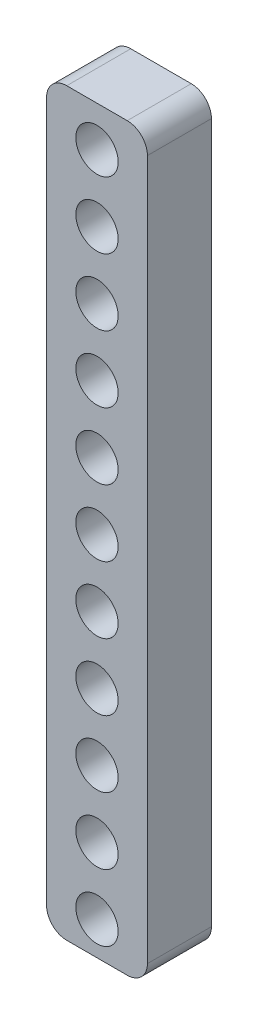
ISO-10303-21;
HEADER;
FILE_DESCRIPTION(('STEP AP214'),'2;1');
FILE_NAME('part.step','',(''),(''),'','','');
FILE_SCHEMA(('AUTOMOTIVE_DESIGN { 1 0 10303 214 1 1 1 1 }'));
ENDSEC;
DATA;
#1=APPLICATION_CONTEXT('core data for automotive mechanical design processes');
#2=APPLICATION_PROTOCOL_DEFINITION('international standard','automotive_design',2000,#1);
#3=PRODUCT_CONTEXT('',#1,'mechanical');
#4=PRODUCT('Part','Part','',(#3));
#5=PRODUCT_RELATED_PRODUCT_CATEGORY('part','',(#4));
#6=PRODUCT_DEFINITION_FORMATION('','',#4);
#7=PRODUCT_DEFINITION_CONTEXT('part definition',#1,'design');
#8=PRODUCT_DEFINITION('design','',#6,#7);
#9=PRODUCT_DEFINITION_SHAPE('','',#8);
#10=(LENGTH_UNIT() NAMED_UNIT(*) SI_UNIT(.MILLI.,.METRE.));
#11=(NAMED_UNIT(*) PLANE_ANGLE_UNIT() SI_UNIT($,.RADIAN.));
#12=(NAMED_UNIT(*) SI_UNIT($,.STERADIAN.) SOLID_ANGLE_UNIT());
#13=UNCERTAINTY_MEASURE_WITH_UNIT(LENGTH_MEASURE(1.E-05),#10,'distance_accuracy_value','');
#14=(GEOMETRIC_REPRESENTATION_CONTEXT(3) GLOBAL_UNCERTAINTY_ASSIGNED_CONTEXT((#13)) GLOBAL_UNIT_ASSIGNED_CONTEXT((#10,
#11,#12)) REPRESENTATION_CONTEXT('',''));
#15=CARTESIAN_POINT('',(0.,0.,0.));
#16=DIRECTION('',(0.,0.,1.));
#17=DIRECTION('',(1.,0.,0.));
#18=AXIS2_PLACEMENT_3D('',#15,#16,#17);
#19=CARTESIAN_POINT('',(-2.99999999999997,-78.,6.35));
#20=DIRECTION('',(0.,0.,-1.));
#21=DIRECTION('',(-1.,0.,0.));
#22=AXIS2_PLACEMENT_3D('',#19,#20,#21);
#23=PLANE('',#22);
#24=DIRECTION('',(1.,0.,0.));
#25=VECTOR('',#24,1.);
#26=CARTESIAN_POINT('',(-8.85626377502826,6.60869565217392,6.35));
#27=LINE('',#26,#25);
#28=CARTESIAN_POINT('',(-3.,6.60869565217392,6.35));
#29=VERTEX_POINT('',#28);
#30=CARTESIAN_POINT('',(2.99999999999997,6.60869565217392,6.35));
#31=VERTEX_POINT('',#30);
#32=EDGE_CURVE('E165',#29,#31,#27,.T.);
#33=ORIENTED_EDGE('',*,*,#32,.T.);
#34=CARTESIAN_POINT('',(2.99999999999997,8.60869565217391,6.35));
#35=DIRECTION('',(0.,0.,-1.));
#36=DIRECTION('',(-1.,0.,0.));
#37=AXIS2_PLACEMENT_3D('',#34,#35,#36);
#38=CIRCLE('',#37,2.);
#39=CARTESIAN_POINT('',(4.99999999999997,8.60869565217391,6.35));
#40=VERTEX_POINT('',#39);
#41=EDGE_CURVE('E47',#31,#40,#38,.F.);
#42=ORIENTED_EDGE('',*,*,#41,.T.);
#43=DIRECTION('',(0.,1.,0.));
#44=VECTOR('',#43,1.);
#45=CARTESIAN_POINT('',(4.99999999999997,-78.,6.35));
#46=LINE('',#45,#44);
#47=CARTESIAN_POINT('',(4.99999999999997,78.,6.35));
#48=VERTEX_POINT('',#47);
#49=EDGE_CURVE('E105',#40,#48,#46,.T.);
#50=ORIENTED_EDGE('',*,*,#49,.T.);
#51=CARTESIAN_POINT('',(2.99999999999997,78.,6.35));
#52=DIRECTION('',(0.,0.,1.));
#53=DIRECTION('',(1.,0.,0.));
#54=AXIS2_PLACEMENT_3D('',#51,#52,#53);
#55=CIRCLE('',#54,2.);
#56=CARTESIAN_POINT('',(2.99999999999996,80.,6.35));
#57=VERTEX_POINT('',#56);
#58=EDGE_CURVE('E109',#48,#57,#55,.T.);
#59=ORIENTED_EDGE('',*,*,#58,.T.);
#60=DIRECTION('',(-1.,0.,0.));
#61=VECTOR('',#60,1.);
#62=CARTESIAN_POINT('',(2.99999999999995,80.,6.35));
#63=LINE('',#62,#61);
#64=CARTESIAN_POINT('',(-3.00000000000002,80.,6.35));
#65=VERTEX_POINT('',#64);
#66=EDGE_CURVE('E130',#57,#65,#63,.T.);
#67=ORIENTED_EDGE('',*,*,#66,.T.);
#68=CARTESIAN_POINT('',(-3.00000000000003,78.,6.35));
#69=DIRECTION('',(0.,0.,1.));
#70=DIRECTION('',(1.,0.,0.));
#71=AXIS2_PLACEMENT_3D('',#68,#69,#70);
#72=CIRCLE('',#71,2.);
#73=CARTESIAN_POINT('',(-5.00000000000003,78.,6.35));
#74=VERTEX_POINT('',#73);
#75=EDGE_CURVE('E132',#65,#74,#72,.T.);
#76=ORIENTED_EDGE('',*,*,#75,.T.);
#77=DIRECTION('',(0.,-1.,0.));
#78=VECTOR('',#77,1.);
#79=CARTESIAN_POINT('',(-4.99999999999997,-78.,6.35));
#80=LINE('',#79,#78);
#81=CARTESIAN_POINT('',(-5.,8.60869565217391,6.35));
#82=VERTEX_POINT('',#81);
#83=EDGE_CURVE('E137',#74,#82,#80,.T.);
#84=ORIENTED_EDGE('',*,*,#83,.T.);
#85=CARTESIAN_POINT('',(-3.,8.60869565217391,6.35));
#86=DIRECTION('',(0.,0.,-1.));
#87=DIRECTION('',(-1.,0.,0.));
#88=AXIS2_PLACEMENT_3D('',#85,#86,#87);
#89=CIRCLE('',#88,2.);
#90=EDGE_CURVE('E54',#82,#29,#89,.F.);
#91=ORIENTED_EDGE('',*,*,#90,.T.);
#92=EDGE_LOOP('',(#33,#42,#50,#59,#67,#76,#84,#91));
#93=FACE_BOUND('',#92,.T.);
#94=CARTESIAN_POINT('',(0.,76.,6.35));
#95=DIRECTION('',(0.,0.,1.));
#96=DIRECTION('',(1.,0.,0.));
#97=AXIS2_PLACEMENT_3D('',#94,#95,#96);
#98=CIRCLE('',#97,2.09999999999985);
#99=CARTESIAN_POINT('',(2.09999999999985,76.,6.35));
#100=VERTEX_POINT('',#99);
#101=EDGE_CURVE('E143',#100,#100,#98,.T.);
#102=ORIENTED_EDGE('',*,*,#101,.F.);
#103=EDGE_LOOP('',(#102));
#104=FACE_BOUND('',#103,.T.);
#105=CARTESIAN_POINT('',(0.,69.3913043478261,6.35));
#106=DIRECTION('',(0.,0.,1.));
#107=DIRECTION('',(1.,0.,0.));
#108=AXIS2_PLACEMENT_3D('',#105,#106,#107);
#109=CIRCLE('',#108,2.10000000000001);
#110=CARTESIAN_POINT('',(2.10000000000008,69.3913043478261,6.35));
#111=VERTEX_POINT('',#110);
#112=EDGE_CURVE('E224',#111,#111,#109,.T.);
#113=ORIENTED_EDGE('',*,*,#112,.F.);
#114=EDGE_LOOP('',(#113));
#115=FACE_BOUND('',#114,.T.);
#116=CARTESIAN_POINT('',(1.37635493464256E-13,62.7826086956522,6.35));
#117=DIRECTION('',(0.,0.,1.));
#118=DIRECTION('',(1.,0.,0.));
#119=AXIS2_PLACEMENT_3D('',#116,#117,#118);
#120=CIRCLE('',#119,2.10000000000001);
#121=CARTESIAN_POINT('',(2.10000000000014,62.7826086956522,6.35));
#122=VERTEX_POINT('',#121);
#123=EDGE_CURVE('E231',#122,#122,#120,.T.);
#124=ORIENTED_EDGE('',*,*,#123,.F.);
#125=EDGE_LOOP('',(#124));
#126=FACE_BOUND('',#125,.T.);
#127=CARTESIAN_POINT('',(2.06453240196385E-13,56.1739130434783,6.35));
#128=DIRECTION('',(0.,0.,1.));
#129=DIRECTION('',(1.,0.,0.));
#130=AXIS2_PLACEMENT_3D('',#127,#128,#129);
#131=CIRCLE('',#130,2.10000000000001);
#132=CARTESIAN_POINT('',(2.10000000000021,56.1739130434783,6.35));
#133=VERTEX_POINT('',#132);
#134=EDGE_CURVE('E236',#133,#133,#131,.T.);
#135=ORIENTED_EDGE('',*,*,#134,.F.);
#136=EDGE_LOOP('',(#135));
#137=FACE_BOUND('',#136,.T.);
#138=CARTESIAN_POINT('',(2.75270986928513E-13,49.5652173913043,6.35));
#139=DIRECTION('',(0.,0.,1.));
#140=DIRECTION('',(1.,0.,0.));
#141=AXIS2_PLACEMENT_3D('',#138,#139,#140);
#142=CIRCLE('',#141,2.10000000000001);
#143=CARTESIAN_POINT('',(2.10000000000028,49.5652173913043,6.35));
#144=VERTEX_POINT('',#143);
#145=EDGE_CURVE('E242',#144,#144,#142,.T.);
#146=ORIENTED_EDGE('',*,*,#145,.F.);
#147=EDGE_LOOP('',(#146));
#148=FACE_BOUND('',#147,.T.);
#149=CARTESIAN_POINT('',(3.44088733660641E-13,42.9565217391304,6.35));
#150=DIRECTION('',(0.,0.,1.));
#151=DIRECTION('',(1.,0.,0.));
#152=AXIS2_PLACEMENT_3D('',#149,#150,#151);
#153=CIRCLE('',#152,2.10000000000001);
#154=CARTESIAN_POINT('',(2.10000000000035,42.9565217391304,6.35));
#155=VERTEX_POINT('',#154);
#156=EDGE_CURVE('E248',#155,#155,#153,.T.);
#157=ORIENTED_EDGE('',*,*,#156,.F.);
#158=EDGE_LOOP('',(#157));
#159=FACE_BOUND('',#158,.T.);
#160=CARTESIAN_POINT('',(4.12906480392769E-13,36.3478260869565,6.35));
#161=DIRECTION('',(0.,0.,1.));
#162=DIRECTION('',(1.,0.,0.));
#163=AXIS2_PLACEMENT_3D('',#160,#161,#162);
#164=CIRCLE('',#163,2.10000000000001);
#165=CARTESIAN_POINT('',(2.10000000000042,36.3478260869565,6.35));
#166=VERTEX_POINT('',#165);
#167=EDGE_CURVE('E254',#166,#166,#164,.T.);
#168=ORIENTED_EDGE('',*,*,#167,.F.);
#169=EDGE_LOOP('',(#168));
#170=FACE_BOUND('',#169,.T.);
#171=CARTESIAN_POINT('',(4.81724227124897E-13,29.7391304347826,6.35));
#172=DIRECTION('',(0.,0.,1.));
#173=DIRECTION('',(1.,0.,0.));
#174=AXIS2_PLACEMENT_3D('',#171,#172,#173);
#175=CIRCLE('',#174,2.10000000000001);
#176=CARTESIAN_POINT('',(2.10000000000049,29.7391304347826,6.35));
#177=VERTEX_POINT('',#176);
#178=EDGE_CURVE('E260',#177,#177,#175,.T.);
#179=ORIENTED_EDGE('',*,*,#178,.F.);
#180=EDGE_LOOP('',(#179));
#181=FACE_BOUND('',#180,.T.);
#182=CARTESIAN_POINT('',(5.50541973857026E-13,23.1304347826087,6.35));
#183=DIRECTION('',(0.,0.,1.));
#184=DIRECTION('',(1.,0.,0.));
#185=AXIS2_PLACEMENT_3D('',#182,#183,#184);
#186=CIRCLE('',#185,2.1);
#187=CARTESIAN_POINT('',(2.10000000000056,23.1304347826087,6.35));
#188=VERTEX_POINT('',#187);
#189=EDGE_CURVE('E266',#188,#188,#186,.T.);
#190=ORIENTED_EDGE('',*,*,#189,.F.);
#191=EDGE_LOOP('',(#190));
#192=FACE_BOUND('',#191,.T.);
#193=CARTESIAN_POINT('',(6.19359720589154E-13,16.5217391304348,6.35));
#194=DIRECTION('',(0.,0.,1.));
#195=DIRECTION('',(1.,0.,0.));
#196=AXIS2_PLACEMENT_3D('',#193,#194,#195);
#197=CIRCLE('',#196,2.1);
#198=CARTESIAN_POINT('',(2.10000000000062,16.5217391304348,6.35));
#199=VERTEX_POINT('',#198);
#200=EDGE_CURVE('E272',#199,#199,#197,.T.);
#201=ORIENTED_EDGE('',*,*,#200,.F.);
#202=EDGE_LOOP('',(#201));
#203=FACE_BOUND('',#202,.T.);
#204=CARTESIAN_POINT('',(6.88177467321282E-13,9.91304347826087,6.35));
#205=DIRECTION('',(0.,0.,1.));
#206=DIRECTION('',(1.,0.,0.));
#207=AXIS2_PLACEMENT_3D('',#204,#205,#206);
#208=CIRCLE('',#207,2.1);
#209=CARTESIAN_POINT('',(2.10000000000069,9.91304347826087,6.35));
#210=VERTEX_POINT('',#209);
#211=EDGE_CURVE('E278',#210,#210,#208,.T.);
#212=ORIENTED_EDGE('',*,*,#211,.F.);
#213=EDGE_LOOP('',(#212));
#214=FACE_BOUND('',#213,.T.);
#215=ADVANCED_FACE('F39',(#93,#104,#115,#126,#137,#148,#159,#170,#181,#192,#203,#214),#23,.F.);
#216=CARTESIAN_POINT('',(-2.99999999999997,-78.,0.));
#217=DIRECTION('',(0.,0.,-1.));
#218=DIRECTION('',(-1.,0.,0.));
#219=AXIS2_PLACEMENT_3D('',#216,#217,#218);
#220=PLANE('',#219);
#221=DIRECTION('',(0.,1.,0.));
#222=VECTOR('',#221,1.);
#223=CARTESIAN_POINT('',(4.99999999999997,-78.,0.));
#224=LINE('',#223,#222);
#225=CARTESIAN_POINT('',(4.99999999999997,8.60869565217391,0.));
#226=VERTEX_POINT('',#225);
#227=CARTESIAN_POINT('',(4.99999999999997,78.,0.));
#228=VERTEX_POINT('',#227);
#229=EDGE_CURVE('E121',#226,#228,#224,.T.);
#230=ORIENTED_EDGE('',*,*,#229,.F.);
#231=CARTESIAN_POINT('',(2.99999999999997,8.60869565217391,0.));
#232=DIRECTION('',(0.,0.,-1.));
#233=DIRECTION('',(-1.,0.,0.));
#234=AXIS2_PLACEMENT_3D('',#231,#232,#233);
#235=CIRCLE('',#234,2.);
#236=CARTESIAN_POINT('',(2.99999999999997,6.60869565217392,0.));
#237=VERTEX_POINT('',#236);
#238=EDGE_CURVE('E160',#226,#237,#235,.T.);
#239=ORIENTED_EDGE('',*,*,#238,.T.);
#240=DIRECTION('',(1.,0.,0.));
#241=VECTOR('',#240,1.);
#242=CARTESIAN_POINT('',(-8.85626377502826,6.60869565217392,0.));
#243=LINE('',#242,#241);
#244=CARTESIAN_POINT('',(-3.,6.60869565217392,0.));
#245=VERTEX_POINT('',#244);
#246=EDGE_CURVE('E170',#245,#237,#243,.T.);
#247=ORIENTED_EDGE('',*,*,#246,.F.);
#248=CARTESIAN_POINT('',(-3.,8.60869565217391,0.));
#249=DIRECTION('',(0.,0.,-1.));
#250=DIRECTION('',(-1.,0.,0.));
#251=AXIS2_PLACEMENT_3D('',#248,#249,#250);
#252=CIRCLE('',#251,2.);
#253=CARTESIAN_POINT('',(-5.,8.60869565217391,0.));
#254=VERTEX_POINT('',#253);
#255=EDGE_CURVE('E158',#245,#254,#252,.T.);
#256=ORIENTED_EDGE('',*,*,#255,.T.);
#257=DIRECTION('',(0.,-1.,0.));
#258=VECTOR('',#257,1.);
#259=CARTESIAN_POINT('',(-4.99999999999997,-78.,0.));
#260=LINE('',#259,#258);
#261=CARTESIAN_POINT('',(-5.00000000000003,78.,0.));
#262=VERTEX_POINT('',#261);
#263=EDGE_CURVE('E115',#262,#254,#260,.T.);
#264=ORIENTED_EDGE('',*,*,#263,.F.);
#265=CARTESIAN_POINT('',(-3.00000000000003,78.,0.));
#266=DIRECTION('',(0.,0.,1.));
#267=DIRECTION('',(1.,0.,0.));
#268=AXIS2_PLACEMENT_3D('',#265,#266,#267);
#269=CIRCLE('',#268,2.);
#270=CARTESIAN_POINT('',(-3.00000000000002,80.,0.));
#271=VERTEX_POINT('',#270);
#272=EDGE_CURVE('E147',#271,#262,#269,.T.);
#273=ORIENTED_EDGE('',*,*,#272,.F.);
#274=DIRECTION('',(-1.,0.,0.));
#275=VECTOR('',#274,1.);
#276=CARTESIAN_POINT('',(2.99999999999995,80.,0.));
#277=LINE('',#276,#275);
#278=CARTESIAN_POINT('',(2.99999999999996,80.,0.));
#279=VERTEX_POINT('',#278);
#280=EDGE_CURVE('E145',#279,#271,#277,.T.);
#281=ORIENTED_EDGE('',*,*,#280,.F.);
#282=CARTESIAN_POINT('',(2.99999999999997,78.,0.));
#283=DIRECTION('',(0.,0.,1.));
#284=DIRECTION('',(1.,0.,0.));
#285=AXIS2_PLACEMENT_3D('',#282,#283,#284);
#286=CIRCLE('',#285,2.);
#287=EDGE_CURVE('E142',#228,#279,#286,.T.);
#288=ORIENTED_EDGE('',*,*,#287,.F.);
#289=EDGE_LOOP('',(#230,#239,#247,#256,#264,#273,#281,#288));
#290=FACE_BOUND('',#289,.T.);
#291=CARTESIAN_POINT('',(6.88177467321282E-13,9.91304347826087,0.));
#292=DIRECTION('',(0.,0.,1.));
#293=DIRECTION('',(1.,0.,0.));
#294=AXIS2_PLACEMENT_3D('',#291,#292,#293);
#295=CIRCLE('',#294,2.1);
#296=CARTESIAN_POINT('',(2.10000000000069,9.91304347826087,0.));
#297=VERTEX_POINT('',#296);
#298=EDGE_CURVE('E169',#297,#297,#295,.T.);
#299=ORIENTED_EDGE('',*,*,#298,.T.);
#300=EDGE_LOOP('',(#299));
#301=FACE_BOUND('',#300,.T.);
#302=CARTESIAN_POINT('',(5.50541973857026E-13,23.1304347826087,0.));
#303=DIRECTION('',(0.,0.,1.));
#304=DIRECTION('',(1.,0.,0.));
#305=AXIS2_PLACEMENT_3D('',#302,#303,#304);
#306=CIRCLE('',#305,2.1);
#307=CARTESIAN_POINT('',(2.10000000000056,23.1304347826087,0.));
#308=VERTEX_POINT('',#307);
#309=EDGE_CURVE('E269',#308,#308,#306,.T.);
#310=ORIENTED_EDGE('',*,*,#309,.T.);
#311=EDGE_LOOP('',(#310));
#312=FACE_BOUND('',#311,.T.);
#313=CARTESIAN_POINT('',(4.12906480392769E-13,36.3478260869565,0.));
#314=DIRECTION('',(0.,0.,1.));
#315=DIRECTION('',(1.,0.,0.));
#316=AXIS2_PLACEMENT_3D('',#313,#314,#315);
#317=CIRCLE('',#316,2.10000000000001);
#318=CARTESIAN_POINT('',(2.10000000000042,36.3478260869565,0.));
#319=VERTEX_POINT('',#318);
#320=EDGE_CURVE('E257',#319,#319,#317,.T.);
#321=ORIENTED_EDGE('',*,*,#320,.T.);
#322=EDGE_LOOP('',(#321));
#323=FACE_BOUND('',#322,.T.);
#324=CARTESIAN_POINT('',(2.75270986928513E-13,49.5652173913043,0.));
#325=DIRECTION('',(0.,0.,1.));
#326=DIRECTION('',(1.,0.,0.));
#327=AXIS2_PLACEMENT_3D('',#324,#325,#326);
#328=CIRCLE('',#327,2.10000000000001);
#329=CARTESIAN_POINT('',(2.10000000000028,49.5652173913043,0.));
#330=VERTEX_POINT('',#329);
#331=EDGE_CURVE('E245',#330,#330,#328,.T.);
#332=ORIENTED_EDGE('',*,*,#331,.T.);
#333=EDGE_LOOP('',(#332));
#334=FACE_BOUND('',#333,.T.);
#335=CARTESIAN_POINT('',(1.37635493464256E-13,62.7826086956522,0.));
#336=DIRECTION('',(0.,0.,1.));
#337=DIRECTION('',(1.,0.,0.));
#338=AXIS2_PLACEMENT_3D('',#335,#336,#337);
#339=CIRCLE('',#338,2.10000000000001);
#340=CARTESIAN_POINT('',(2.10000000000014,62.7826086956522,0.));
#341=VERTEX_POINT('',#340);
#342=EDGE_CURVE('E233',#341,#341,#339,.T.);
#343=ORIENTED_EDGE('',*,*,#342,.T.);
#344=EDGE_LOOP('',(#343));
#345=FACE_BOUND('',#344,.T.);
#346=CARTESIAN_POINT('',(0.,76.,0.));
#347=DIRECTION('',(0.,0.,1.));
#348=DIRECTION('',(1.,0.,0.));
#349=AXIS2_PLACEMENT_3D('',#346,#347,#348);
#350=CIRCLE('',#349,2.09999999999985);
#351=CARTESIAN_POINT('',(2.09999999999985,76.,0.));
#352=VERTEX_POINT('',#351);
#353=EDGE_CURVE('E222',#352,#352,#350,.T.);
#354=ORIENTED_EDGE('',*,*,#353,.T.);
#355=EDGE_LOOP('',(#354));
#356=FACE_BOUND('',#355,.T.);
#357=CARTESIAN_POINT('',(0.,69.3913043478261,0.));
#358=DIRECTION('',(0.,0.,1.));
#359=DIRECTION('',(1.,0.,0.));
#360=AXIS2_PLACEMENT_3D('',#357,#358,#359);
#361=CIRCLE('',#360,2.10000000000001);
#362=CARTESIAN_POINT('',(2.10000000000008,69.3913043478261,0.));
#363=VERTEX_POINT('',#362);
#364=EDGE_CURVE('E227',#363,#363,#361,.T.);
#365=ORIENTED_EDGE('',*,*,#364,.T.);
#366=EDGE_LOOP('',(#365));
#367=FACE_BOUND('',#366,.T.);
#368=CARTESIAN_POINT('',(2.06453240196385E-13,56.1739130434783,0.));
#369=DIRECTION('',(0.,0.,1.));
#370=DIRECTION('',(1.,0.,0.));
#371=AXIS2_PLACEMENT_3D('',#368,#369,#370);
#372=CIRCLE('',#371,2.10000000000001);
#373=CARTESIAN_POINT('',(2.10000000000021,56.1739130434783,0.));
#374=VERTEX_POINT('',#373);
#375=EDGE_CURVE('E239',#374,#374,#372,.T.);
#376=ORIENTED_EDGE('',*,*,#375,.T.);
#377=EDGE_LOOP('',(#376));
#378=FACE_BOUND('',#377,.T.);
#379=CARTESIAN_POINT('',(3.44088733660641E-13,42.9565217391304,0.));
#380=DIRECTION('',(0.,0.,1.));
#381=DIRECTION('',(1.,0.,0.));
#382=AXIS2_PLACEMENT_3D('',#379,#380,#381);
#383=CIRCLE('',#382,2.10000000000001);
#384=CARTESIAN_POINT('',(2.10000000000035,42.9565217391304,0.));
#385=VERTEX_POINT('',#384);
#386=EDGE_CURVE('E251',#385,#385,#383,.T.);
#387=ORIENTED_EDGE('',*,*,#386,.T.);
#388=EDGE_LOOP('',(#387));
#389=FACE_BOUND('',#388,.T.);
#390=CARTESIAN_POINT('',(4.81724227124897E-13,29.7391304347826,0.));
#391=DIRECTION('',(0.,0.,1.));
#392=DIRECTION('',(1.,0.,0.));
#393=AXIS2_PLACEMENT_3D('',#390,#391,#392);
#394=CIRCLE('',#393,2.10000000000001);
#395=CARTESIAN_POINT('',(2.10000000000049,29.7391304347826,0.));
#396=VERTEX_POINT('',#395);
#397=EDGE_CURVE('E263',#396,#396,#394,.T.);
#398=ORIENTED_EDGE('',*,*,#397,.T.);
#399=EDGE_LOOP('',(#398));
#400=FACE_BOUND('',#399,.T.);
#401=CARTESIAN_POINT('',(6.19359720589154E-13,16.5217391304348,0.));
#402=DIRECTION('',(0.,0.,1.));
#403=DIRECTION('',(1.,0.,0.));
#404=AXIS2_PLACEMENT_3D('',#401,#402,#403);
#405=CIRCLE('',#404,2.1);
#406=CARTESIAN_POINT('',(2.10000000000062,16.5217391304348,0.));
#407=VERTEX_POINT('',#406);
#408=EDGE_CURVE('E275',#407,#407,#405,.T.);
#409=ORIENTED_EDGE('',*,*,#408,.T.);
#410=EDGE_LOOP('',(#409));
#411=FACE_BOUND('',#410,.T.);
#412=ADVANCED_FACE('F175',(#290,#301,#312,#323,#334,#345,#356,#367,#378,#389,#400,#411),#220,.T.);
#413=CARTESIAN_POINT('',(4.99999999999997,-78.,6.35));
#414=DIRECTION('',(-1.,0.,0.));
#415=DIRECTION('',(0.,0.,1.));
#416=AXIS2_PLACEMENT_3D('',#413,#414,#415);
#417=PLANE('',#416);
#418=ORIENTED_EDGE('',*,*,#49,.F.);
#419=DIRECTION('',(0.,0.,-1.));
#420=VECTOR('',#419,1.);
#421=CARTESIAN_POINT('',(4.99999999999997,8.60869565217391,6.35));
#422=LINE('',#421,#420);
#423=EDGE_CURVE('E124',#40,#226,#422,.T.);
#424=ORIENTED_EDGE('',*,*,#423,.T.);
#425=ORIENTED_EDGE('',*,*,#229,.T.);
#426=DIRECTION('',(0.,0.,-1.));
#427=VECTOR('',#426,1.);
#428=CARTESIAN_POINT('',(4.99999999999997,78.,6.35));
#429=LINE('',#428,#427);
#430=EDGE_CURVE('E118',#48,#228,#429,.T.);
#431=ORIENTED_EDGE('',*,*,#430,.F.);
#432=EDGE_LOOP('',(#418,#424,#425,#431));
#433=FACE_BOUND('',#432,.T.);
#434=ADVANCED_FACE('F119',(#433),#417,.F.);
#435=CARTESIAN_POINT('',(2.99999999999997,78.,6.35));
#436=DIRECTION('',(0.,0.,-1.));
#437=DIRECTION('',(-1.,0.,0.));
#438=AXIS2_PLACEMENT_3D('',#435,#436,#437);
#439=CYLINDRICAL_SURFACE('',#438,2.);
#440=ORIENTED_EDGE('',*,*,#287,.T.);
#441=DIRECTION('',(0.,0.,-1.));
#442=VECTOR('',#441,1.);
#443=CARTESIAN_POINT('',(2.99999999999996,80.,6.35));
#444=LINE('',#443,#442);
#445=EDGE_CURVE('E125',#57,#279,#444,.T.);
#446=ORIENTED_EDGE('',*,*,#445,.F.);
#447=ORIENTED_EDGE('',*,*,#58,.F.);
#448=ORIENTED_EDGE('',*,*,#430,.T.);
#449=EDGE_LOOP('',(#440,#446,#447,#448));
#450=FACE_BOUND('',#449,.T.);
#451=ADVANCED_FACE('F127',(#450),#439,.T.);
#452=CARTESIAN_POINT('',(2.99999999999995,80.,6.35));
#453=DIRECTION('',(0.,-1.,0.));
#454=DIRECTION('',(0.,0.,-1.));
#455=AXIS2_PLACEMENT_3D('',#452,#453,#454);
#456=PLANE('',#455);
#457=ORIENTED_EDGE('',*,*,#280,.T.);
#458=DIRECTION('',(0.,0.,-1.));
#459=VECTOR('',#458,1.);
#460=CARTESIAN_POINT('',(-3.00000000000002,80.,6.35));
#461=LINE('',#460,#459);
#462=EDGE_CURVE('E153',#65,#271,#461,.T.);
#463=ORIENTED_EDGE('',*,*,#462,.F.);
#464=ORIENTED_EDGE('',*,*,#66,.F.);
#465=ORIENTED_EDGE('',*,*,#445,.T.);
#466=EDGE_LOOP('',(#457,#463,#464,#465));
#467=FACE_BOUND('',#466,.T.);
#468=ADVANCED_FACE('F187',(#467),#456,.F.);
#469=CARTESIAN_POINT('',(-3.00000000000003,78.,6.35));
#470=DIRECTION('',(0.,0.,-1.));
#471=DIRECTION('',(-1.,0.,0.));
#472=AXIS2_PLACEMENT_3D('',#469,#470,#471);
#473=CYLINDRICAL_SURFACE('',#472,2.);
#474=ORIENTED_EDGE('',*,*,#272,.T.);
#475=DIRECTION('',(0.,0.,-1.));
#476=VECTOR('',#475,1.);
#477=CARTESIAN_POINT('',(-5.00000000000003,78.,6.35));
#478=LINE('',#477,#476);
#479=EDGE_CURVE('E140',#74,#262,#478,.T.);
#480=ORIENTED_EDGE('',*,*,#479,.F.);
#481=ORIENTED_EDGE('',*,*,#75,.F.);
#482=ORIENTED_EDGE('',*,*,#462,.T.);
#483=EDGE_LOOP('',(#474,#480,#481,#482));
#484=FACE_BOUND('',#483,.T.);
#485=ADVANCED_FACE('F183',(#484),#473,.T.);
#486=CARTESIAN_POINT('',(-4.99999999999997,-78.,6.35));
#487=DIRECTION('',(1.,0.,0.));
#488=DIRECTION('',(0.,1.,0.));
#489=AXIS2_PLACEMENT_3D('',#486,#487,#488);
#490=PLANE('',#489);
#491=ORIENTED_EDGE('',*,*,#263,.T.);
#492=DIRECTION('',(0.,0.,1.));
#493=VECTOR('',#492,1.);
#494=CARTESIAN_POINT('',(-5.,8.60869565217391,6.35));
#495=LINE('',#494,#493);
#496=EDGE_CURVE('E11',#254,#82,#495,.T.);
#497=ORIENTED_EDGE('',*,*,#496,.T.);
#498=ORIENTED_EDGE('',*,*,#83,.F.);
#499=ORIENTED_EDGE('',*,*,#479,.T.);
#500=EDGE_LOOP('',(#491,#497,#498,#499));
#501=FACE_BOUND('',#500,.T.);
#502=ADVANCED_FACE('F179',(#501),#490,.F.);
#503=CARTESIAN_POINT('',(0.,76.,6.35));
#504=DIRECTION('',(0.,0.,-1.));
#505=DIRECTION('',(-1.,0.,0.));
#506=AXIS2_PLACEMENT_3D('',#503,#504,#505);
#507=CYLINDRICAL_SURFACE('',#506,2.09999999999985);
#508=ORIENTED_EDGE('',*,*,#101,.T.);
#509=EDGE_LOOP('',(#508));
#510=FACE_BOUND('',#509,.T.);
#511=ORIENTED_EDGE('',*,*,#353,.F.);
#512=EDGE_LOOP('',(#511));
#513=FACE_BOUND('',#512,.T.);
#514=ADVANCED_FACE('F203',(#510,#513),#507,.F.);
#515=CARTESIAN_POINT('',(0.,69.3913043478261,6.35));
#516=DIRECTION('',(0.,0.,-1.));
#517=DIRECTION('',(-1.,0.,0.));
#518=AXIS2_PLACEMENT_3D('',#515,#516,#517);
#519=CYLINDRICAL_SURFACE('',#518,2.10000000000001);
#520=ORIENTED_EDGE('',*,*,#112,.T.);
#521=EDGE_LOOP('',(#520));
#522=FACE_BOUND('',#521,.T.);
#523=ORIENTED_EDGE('',*,*,#364,.F.);
#524=EDGE_LOOP('',(#523));
#525=FACE_BOUND('',#524,.T.);
#526=ADVANCED_FACE('F210',(#522,#525),#519,.F.);
#527=CARTESIAN_POINT('',(1.37635493464256E-13,62.7826086956522,6.35));
#528=DIRECTION('',(0.,0.,-1.));
#529=DIRECTION('',(-1.,0.,0.));
#530=AXIS2_PLACEMENT_3D('',#527,#528,#529);
#531=CYLINDRICAL_SURFACE('',#530,2.10000000000001);
#532=ORIENTED_EDGE('',*,*,#123,.T.);
#533=EDGE_LOOP('',(#532));
#534=FACE_BOUND('',#533,.T.);
#535=ORIENTED_EDGE('',*,*,#342,.F.);
#536=EDGE_LOOP('',(#535));
#537=FACE_BOUND('',#536,.T.);
#538=ADVANCED_FACE('F215',(#534,#537),#531,.F.);
#539=CARTESIAN_POINT('',(2.06453240196385E-13,56.1739130434783,6.35));
#540=DIRECTION('',(0.,0.,-1.));
#541=DIRECTION('',(-1.,0.,0.));
#542=AXIS2_PLACEMENT_3D('',#539,#540,#541);
#543=CYLINDRICAL_SURFACE('',#542,2.10000000000001);
#544=ORIENTED_EDGE('',*,*,#134,.T.);
#545=EDGE_LOOP('',(#544));
#546=FACE_BOUND('',#545,.T.);
#547=ORIENTED_EDGE('',*,*,#375,.F.);
#548=EDGE_LOOP('',(#547));
#549=FACE_BOUND('',#548,.T.);
#550=ADVANCED_FACE('F334',(#546,#549),#543,.F.);
#551=CARTESIAN_POINT('',(2.75270986928513E-13,49.5652173913043,6.35));
#552=DIRECTION('',(0.,0.,-1.));
#553=DIRECTION('',(-1.,0.,0.));
#554=AXIS2_PLACEMENT_3D('',#551,#552,#553);
#555=CYLINDRICAL_SURFACE('',#554,2.10000000000001);
#556=ORIENTED_EDGE('',*,*,#145,.T.);
#557=EDGE_LOOP('',(#556));
#558=FACE_BOUND('',#557,.T.);
#559=ORIENTED_EDGE('',*,*,#331,.F.);
#560=EDGE_LOOP('',(#559));
#561=FACE_BOUND('',#560,.T.);
#562=ADVANCED_FACE('F344',(#558,#561),#555,.F.);
#563=CARTESIAN_POINT('',(3.44088733660641E-13,42.9565217391304,6.35));
#564=DIRECTION('',(0.,0.,-1.));
#565=DIRECTION('',(-1.,0.,0.));
#566=AXIS2_PLACEMENT_3D('',#563,#564,#565);
#567=CYLINDRICAL_SURFACE('',#566,2.10000000000001);
#568=ORIENTED_EDGE('',*,*,#156,.T.);
#569=EDGE_LOOP('',(#568));
#570=FACE_BOUND('',#569,.T.);
#571=ORIENTED_EDGE('',*,*,#386,.F.);
#572=EDGE_LOOP('',(#571));
#573=FACE_BOUND('',#572,.T.);
#574=ADVANCED_FACE('F354',(#570,#573),#567,.F.);
#575=CARTESIAN_POINT('',(4.12906480392769E-13,36.3478260869565,6.35));
#576=DIRECTION('',(0.,0.,-1.));
#577=DIRECTION('',(-1.,0.,0.));
#578=AXIS2_PLACEMENT_3D('',#575,#576,#577);
#579=CYLINDRICAL_SURFACE('',#578,2.10000000000001);
#580=ORIENTED_EDGE('',*,*,#167,.T.);
#581=EDGE_LOOP('',(#580));
#582=FACE_BOUND('',#581,.T.);
#583=ORIENTED_EDGE('',*,*,#320,.F.);
#584=EDGE_LOOP('',(#583));
#585=FACE_BOUND('',#584,.T.);
#586=ADVANCED_FACE('F364',(#582,#585),#579,.F.);
#587=CARTESIAN_POINT('',(4.81724227124897E-13,29.7391304347826,6.35));
#588=DIRECTION('',(0.,0.,-1.));
#589=DIRECTION('',(-1.,0.,0.));
#590=AXIS2_PLACEMENT_3D('',#587,#588,#589);
#591=CYLINDRICAL_SURFACE('',#590,2.10000000000001);
#592=ORIENTED_EDGE('',*,*,#178,.T.);
#593=EDGE_LOOP('',(#592));
#594=FACE_BOUND('',#593,.T.);
#595=ORIENTED_EDGE('',*,*,#397,.F.);
#596=EDGE_LOOP('',(#595));
#597=FACE_BOUND('',#596,.T.);
#598=ADVANCED_FACE('F374',(#594,#597),#591,.F.);
#599=CARTESIAN_POINT('',(5.50541973857026E-13,23.1304347826087,6.35));
#600=DIRECTION('',(0.,0.,-1.));
#601=DIRECTION('',(-1.,0.,0.));
#602=AXIS2_PLACEMENT_3D('',#599,#600,#601);
#603=CYLINDRICAL_SURFACE('',#602,2.1);
#604=ORIENTED_EDGE('',*,*,#189,.T.);
#605=EDGE_LOOP('',(#604));
#606=FACE_BOUND('',#605,.T.);
#607=ORIENTED_EDGE('',*,*,#309,.F.);
#608=EDGE_LOOP('',(#607));
#609=FACE_BOUND('',#608,.T.);
#610=ADVANCED_FACE('F384',(#606,#609),#603,.F.);
#611=CARTESIAN_POINT('',(6.19359720589154E-13,16.5217391304348,6.35));
#612=DIRECTION('',(0.,0.,-1.));
#613=DIRECTION('',(-1.,0.,0.));
#614=AXIS2_PLACEMENT_3D('',#611,#612,#613);
#615=CYLINDRICAL_SURFACE('',#614,2.1);
#616=ORIENTED_EDGE('',*,*,#200,.T.);
#617=EDGE_LOOP('',(#616));
#618=FACE_BOUND('',#617,.T.);
#619=ORIENTED_EDGE('',*,*,#408,.F.);
#620=EDGE_LOOP('',(#619));
#621=FACE_BOUND('',#620,.T.);
#622=ADVANCED_FACE('F394',(#618,#621),#615,.F.);
#623=CARTESIAN_POINT('',(6.88177467321282E-13,9.91304347826087,6.35));
#624=DIRECTION('',(0.,0.,-1.));
#625=DIRECTION('',(-1.,0.,0.));
#626=AXIS2_PLACEMENT_3D('',#623,#624,#625);
#627=CYLINDRICAL_SURFACE('',#626,2.1);
#628=ORIENTED_EDGE('',*,*,#211,.T.);
#629=EDGE_LOOP('',(#628));
#630=FACE_BOUND('',#629,.T.);
#631=ORIENTED_EDGE('',*,*,#298,.F.);
#632=EDGE_LOOP('',(#631));
#633=FACE_BOUND('',#632,.T.);
#634=ADVANCED_FACE('F292',(#630,#633),#627,.F.);
#635=CARTESIAN_POINT('',(-8.85626377502826,6.60869565217392,6.35));
#636=DIRECTION('',(0.,1.,0.));
#637=DIRECTION('',(-1.,0.,0.));
#638=AXIS2_PLACEMENT_3D('',#635,#636,#637);
#639=PLANE('',#638);
#640=ORIENTED_EDGE('',*,*,#246,.T.);
#641=DIRECTION('',(0.,0.,-1.));
#642=VECTOR('',#641,1.);
#643=CARTESIAN_POINT('',(2.99999999999997,6.60869565217392,6.35));
#644=LINE('',#643,#642);
#645=EDGE_CURVE('E61',#237,#31,#644,.F.);
#646=ORIENTED_EDGE('',*,*,#645,.T.);
#647=ORIENTED_EDGE('',*,*,#32,.F.);
#648=DIRECTION('',(0.,0.,1.));
#649=VECTOR('',#648,1.);
#650=CARTESIAN_POINT('',(-3.,6.60869565217392,6.35));
#651=LINE('',#650,#649);
#652=EDGE_CURVE('E162',#29,#245,#651,.F.);
#653=ORIENTED_EDGE('',*,*,#652,.T.);
#654=EDGE_LOOP('',(#640,#646,#647,#653));
#655=FACE_BOUND('',#654,.T.);
#656=ADVANCED_FACE('F167',(#655),#639,.F.);
#657=CARTESIAN_POINT('',(2.99999999999997,8.60869565217391,6.35));
#658=DIRECTION('',(0.,0.,-1.));
#659=DIRECTION('',(-1.,0.,0.));
#660=AXIS2_PLACEMENT_3D('',#657,#658,#659);
#661=CYLINDRICAL_SURFACE('',#660,2.);
#662=ORIENTED_EDGE('',*,*,#41,.F.);
#663=ORIENTED_EDGE('',*,*,#645,.F.);
#664=ORIENTED_EDGE('',*,*,#238,.F.);
#665=ORIENTED_EDGE('',*,*,#423,.F.);
#666=EDGE_LOOP('',(#662,#663,#664,#665));
#667=FACE_BOUND('',#666,.T.);
#668=ADVANCED_FACE('F286',(#667),#661,.T.);
#669=CARTESIAN_POINT('',(-3.,8.60869565217391,6.35));
#670=DIRECTION('',(0.,0.,1.));
#671=DIRECTION('',(1.,0.,0.));
#672=AXIS2_PLACEMENT_3D('',#669,#670,#671);
#673=CYLINDRICAL_SURFACE('',#672,2.);
#674=ORIENTED_EDGE('',*,*,#255,.F.);
#675=ORIENTED_EDGE('',*,*,#652,.F.);
#676=ORIENTED_EDGE('',*,*,#90,.F.);
#677=ORIENTED_EDGE('',*,*,#496,.F.);
#678=EDGE_LOOP('',(#674,#675,#676,#677));
#679=FACE_BOUND('',#678,.T.);
#680=ADVANCED_FACE('F41',(#679),#673,.T.);
#681=CLOSED_SHELL('',(#215,#412,#434,#451,#468,#485,#502,#514,#526,#538,#550,#562,#574,#586,
#598,#610,#622,#634,#656,#668,#680));
#682=MANIFOLD_SOLID_BREP('B2',#681);
#683=ADVANCED_BREP_SHAPE_REPRESENTATION('',(#18,#682),#14);
#684=SHAPE_DEFINITION_REPRESENTATION(#9,#683);
ENDSEC;
END-ISO-10303-21;
